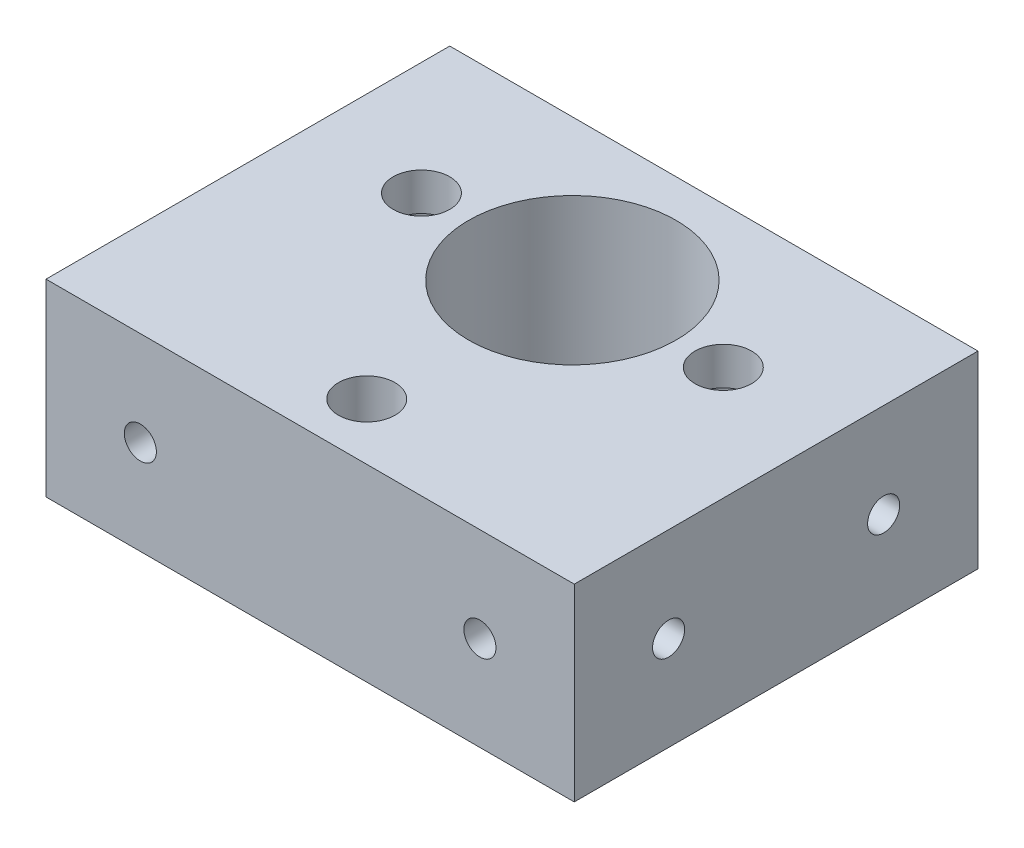
ISO-10303-21;
HEADER;
FILE_DESCRIPTION(('STEP AP214'),'2;1');
FILE_NAME('part.step','',(''),(''),'','','');
FILE_SCHEMA(('AUTOMOTIVE_DESIGN { 1 0 10303 214 1 1 1 1 }'));
ENDSEC;
DATA;
#1=APPLICATION_CONTEXT('core data for automotive mechanical design processes');
#2=APPLICATION_PROTOCOL_DEFINITION('international standard','automotive_design',2000,#1);
#3=PRODUCT_CONTEXT('',#1,'mechanical');
#4=PRODUCT('Part','Part','',(#3));
#5=PRODUCT_RELATED_PRODUCT_CATEGORY('part','',(#4));
#6=PRODUCT_DEFINITION_FORMATION('','',#4);
#7=PRODUCT_DEFINITION_CONTEXT('part definition',#1,'design');
#8=PRODUCT_DEFINITION('design','',#6,#7);
#9=PRODUCT_DEFINITION_SHAPE('','',#8);
#10=(LENGTH_UNIT() NAMED_UNIT(*) SI_UNIT(.MILLI.,.METRE.));
#11=(NAMED_UNIT(*) PLANE_ANGLE_UNIT() SI_UNIT($,.RADIAN.));
#12=(NAMED_UNIT(*) SI_UNIT($,.STERADIAN.) SOLID_ANGLE_UNIT());
#13=UNCERTAINTY_MEASURE_WITH_UNIT(LENGTH_MEASURE(1.E-05),#10,'distance_accuracy_value','');
#14=(GEOMETRIC_REPRESENTATION_CONTEXT(3) GLOBAL_UNCERTAINTY_ASSIGNED_CONTEXT((#13)) GLOBAL_UNIT_ASSIGNED_CONTEXT((#10,
#11,#12)) REPRESENTATION_CONTEXT('',''));
#15=CARTESIAN_POINT('',(0.,0.,0.));
#16=DIRECTION('',(0.,0.,1.));
#17=DIRECTION('',(1.,0.,0.));
#18=AXIS2_PLACEMENT_3D('',#15,#16,#17);
#19=CARTESIAN_POINT('',(-14.,10.,0.));
#20=DIRECTION('',(-1.,0.,0.));
#21=DIRECTION('',(0.,0.,1.));
#22=AXIS2_PLACEMENT_3D('',#19,#20,#21);
#23=PLANE('',#22);
#24=CARTESIAN_POINT('',(-14.,5.,8.9));
#25=DIRECTION('',(-1.,0.,0.));
#26=DIRECTION('',(0.,0.,1.));
#27=AXIS2_PLACEMENT_3D('',#24,#25,#26);
#28=CIRCLE('',#27,0.85);
#29=CARTESIAN_POINT('',(-14.,5.,9.74999999999999));
#30=VERTEX_POINT('',#29);
#31=EDGE_CURVE('E505',#30,#30,#28,.T.);
#32=ORIENTED_EDGE('',*,*,#31,.F.);
#33=EDGE_LOOP('',(#32));
#34=FACE_BOUND('',#33,.T.);
#35=CARTESIAN_POINT('',(-14.,5.,-2.5));
#36=DIRECTION('',(-1.,0.,0.));
#37=DIRECTION('',(0.,0.,1.));
#38=AXIS2_PLACEMENT_3D('',#35,#36,#37);
#39=CIRCLE('',#38,0.849999999999999);
#40=CARTESIAN_POINT('',(-14.,5.,-1.65));
#41=VERTEX_POINT('',#40);
#42=EDGE_CURVE('E495',#41,#41,#39,.T.);
#43=ORIENTED_EDGE('',*,*,#42,.F.);
#44=EDGE_LOOP('',(#43));
#45=FACE_BOUND('',#44,.T.);
#46=DIRECTION('',(0.,0.,-1.));
#47=VECTOR('',#46,1.);
#48=CARTESIAN_POINT('',(-14.,0.,0.));
#49=LINE('',#48,#47);
#50=CARTESIAN_POINT('',(-14.,0.,13.9));
#51=VERTEX_POINT('',#50);
#52=CARTESIAN_POINT('',(-14.,0.,-7.5));
#53=VERTEX_POINT('',#52);
#54=EDGE_CURVE('E122',#51,#53,#49,.T.);
#55=ORIENTED_EDGE('',*,*,#54,.F.);
#56=DIRECTION('',(0.,-1.,0.));
#57=VECTOR('',#56,1.);
#58=CARTESIAN_POINT('',(-14.,10.,13.9));
#59=LINE('',#58,#57);
#60=CARTESIAN_POINT('',(-14.,10.,13.9));
#61=VERTEX_POINT('',#60);
#62=EDGE_CURVE('E12',#61,#51,#59,.T.);
#63=ORIENTED_EDGE('',*,*,#62,.F.);
#64=DIRECTION('',(0.,0.,-1.));
#65=VECTOR('',#64,1.);
#66=CARTESIAN_POINT('',(-14.,10.,0.));
#67=LINE('',#66,#65);
#68=CARTESIAN_POINT('',(-14.,10.,-7.5));
#69=VERTEX_POINT('',#68);
#70=EDGE_CURVE('E103',#61,#69,#67,.T.);
#71=ORIENTED_EDGE('',*,*,#70,.T.);
#72=DIRECTION('',(0.,-1.,0.));
#73=VECTOR('',#72,1.);
#74=CARTESIAN_POINT('',(-14.,10.,-7.5));
#75=LINE('',#74,#73);
#76=EDGE_CURVE('E59',#69,#53,#75,.T.);
#77=ORIENTED_EDGE('',*,*,#76,.T.);
#78=EDGE_LOOP('',(#55,#63,#71,#77));
#79=FACE_BOUND('',#78,.T.);
#80=ADVANCED_FACE('F40',(#34,#45,#79),#23,.T.);
#81=CARTESIAN_POINT('',(0.,10.,13.9));
#82=DIRECTION('',(0.,0.,1.));
#83=DIRECTION('',(1.,0.,0.));
#84=AXIS2_PLACEMENT_3D('',#81,#82,#83);
#85=PLANE('',#84);
#86=CARTESIAN_POINT('',(-9.,5.,13.9));
#87=DIRECTION('',(0.,0.,1.));
#88=DIRECTION('',(1.,0.,0.));
#89=AXIS2_PLACEMENT_3D('',#86,#87,#88);
#90=CIRCLE('',#89,0.85);
#91=CARTESIAN_POINT('',(-8.15,5.,13.9));
#92=VERTEX_POINT('',#91);
#93=EDGE_CURVE('E496',#92,#92,#90,.T.);
#94=ORIENTED_EDGE('',*,*,#93,.F.);
#95=EDGE_LOOP('',(#94));
#96=FACE_BOUND('',#95,.T.);
#97=CARTESIAN_POINT('',(9.,5.,13.9));
#98=DIRECTION('',(0.,0.,1.));
#99=DIRECTION('',(1.,0.,0.));
#100=AXIS2_PLACEMENT_3D('',#97,#98,#99);
#101=CIRCLE('',#100,0.85);
#102=CARTESIAN_POINT('',(9.85,5.,13.9));
#103=VERTEX_POINT('',#102);
#104=EDGE_CURVE('E477',#103,#103,#101,.T.);
#105=ORIENTED_EDGE('',*,*,#104,.F.);
#106=EDGE_LOOP('',(#105));
#107=FACE_BOUND('',#106,.T.);
#108=DIRECTION('',(-1.,0.,0.));
#109=VECTOR('',#108,1.);
#110=CARTESIAN_POINT('',(0.,0.,13.9));
#111=LINE('',#110,#109);
#112=CARTESIAN_POINT('',(14.,0.,13.9));
#113=VERTEX_POINT('',#112);
#114=EDGE_CURVE('E91',#113,#51,#111,.T.);
#115=ORIENTED_EDGE('',*,*,#114,.F.);
#116=DIRECTION('',(0.,-1.,0.));
#117=VECTOR('',#116,1.);
#118=CARTESIAN_POINT('',(14.,10.,13.9));
#119=LINE('',#118,#117);
#120=CARTESIAN_POINT('',(14.,10.,13.9));
#121=VERTEX_POINT('',#120);
#122=EDGE_CURVE('E50',#121,#113,#119,.T.);
#123=ORIENTED_EDGE('',*,*,#122,.F.);
#124=DIRECTION('',(-1.,0.,0.));
#125=VECTOR('',#124,1.);
#126=CARTESIAN_POINT('',(0.,10.,13.9));
#127=LINE('',#126,#125);
#128=EDGE_CURVE('E89',#121,#61,#127,.T.);
#129=ORIENTED_EDGE('',*,*,#128,.T.);
#130=ORIENTED_EDGE('',*,*,#62,.T.);
#131=EDGE_LOOP('',(#115,#123,#129,#130));
#132=FACE_BOUND('',#131,.T.);
#133=ADVANCED_FACE('F87',(#96,#107,#132),#85,.T.);
#134=CARTESIAN_POINT('',(14.,10.,0.));
#135=DIRECTION('',(-1.,0.,0.));
#136=DIRECTION('',(0.,0.,1.));
#137=AXIS2_PLACEMENT_3D('',#134,#135,#136);
#138=PLANE('',#137);
#139=CARTESIAN_POINT('',(14.,5.,8.9));
#140=DIRECTION('',(-1.,0.,0.));
#141=DIRECTION('',(0.,0.,1.));
#142=AXIS2_PLACEMENT_3D('',#139,#140,#141);
#143=CIRCLE('',#142,0.85);
#144=CARTESIAN_POINT('',(14.,5.,9.74999999999999));
#145=VERTEX_POINT('',#144);
#146=EDGE_CURVE('E515',#145,#145,#143,.T.);
#147=ORIENTED_EDGE('',*,*,#146,.T.);
#148=EDGE_LOOP('',(#147));
#149=FACE_BOUND('',#148,.T.);
#150=CARTESIAN_POINT('',(14.,5.,-2.5));
#151=DIRECTION('',(-1.,0.,0.));
#152=DIRECTION('',(0.,0.,1.));
#153=AXIS2_PLACEMENT_3D('',#150,#151,#152);
#154=CIRCLE('',#153,0.849999999999999);
#155=CARTESIAN_POINT('',(14.,5.,-1.65));
#156=VERTEX_POINT('',#155);
#157=EDGE_CURVE('E504',#156,#156,#154,.T.);
#158=ORIENTED_EDGE('',*,*,#157,.T.);
#159=EDGE_LOOP('',(#158));
#160=FACE_BOUND('',#159,.T.);
#161=DIRECTION('',(0.,0.,-1.));
#162=VECTOR('',#161,1.);
#163=CARTESIAN_POINT('',(14.,0.,0.));
#164=LINE('',#163,#162);
#165=CARTESIAN_POINT('',(14.,0.,-7.5));
#166=VERTEX_POINT('',#165);
#167=EDGE_CURVE('E125',#113,#166,#164,.T.);
#168=ORIENTED_EDGE('',*,*,#167,.T.);
#169=DIRECTION('',(0.,-1.,0.));
#170=VECTOR('',#169,1.);
#171=CARTESIAN_POINT('',(14.,10.,-7.5));
#172=LINE('',#171,#170);
#173=CARTESIAN_POINT('',(14.,10.,-7.5));
#174=VERTEX_POINT('',#173);
#175=EDGE_CURVE('E73',#174,#166,#172,.T.);
#176=ORIENTED_EDGE('',*,*,#175,.F.);
#177=DIRECTION('',(0.,0.,-1.));
#178=VECTOR('',#177,1.);
#179=CARTESIAN_POINT('',(14.,10.,0.));
#180=LINE('',#179,#178);
#181=EDGE_CURVE('E95',#121,#174,#180,.T.);
#182=ORIENTED_EDGE('',*,*,#181,.F.);
#183=ORIENTED_EDGE('',*,*,#122,.T.);
#184=EDGE_LOOP('',(#168,#176,#182,#183));
#185=FACE_BOUND('',#184,.T.);
#186=ADVANCED_FACE('F96',(#149,#160,#185),#138,.F.);
#187=CARTESIAN_POINT('',(8.,10.,0.));
#188=DIRECTION('',(0.,-1.,0.));
#189=DIRECTION('',(0.,0.,-1.));
#190=AXIS2_PLACEMENT_3D('',#187,#188,#189);
#191=CYLINDRICAL_SURFACE('',#190,1.5);
#192=CARTESIAN_POINT('',(8.,8.,0.));
#193=DIRECTION('',(0.,1.,0.));
#194=DIRECTION('',(0.,0.,1.));
#195=AXIS2_PLACEMENT_3D('',#192,#193,#194);
#196=CIRCLE('',#195,1.5);
#197=CARTESIAN_POINT('',(8.,8.,1.5));
#198=VERTEX_POINT('',#197);
#199=EDGE_CURVE('E44',#198,#198,#196,.T.);
#200=ORIENTED_EDGE('',*,*,#199,.F.);
#201=EDGE_LOOP('',(#200));
#202=FACE_BOUND('',#201,.T.);
#203=CARTESIAN_POINT('',(8.,10.,0.));
#204=DIRECTION('',(0.,1.,0.));
#205=DIRECTION('',(0.,0.,1.));
#206=AXIS2_PLACEMENT_3D('',#203,#204,#205);
#207=CIRCLE('',#206,1.5);
#208=CARTESIAN_POINT('',(8.,10.,1.5));
#209=VERTEX_POINT('',#208);
#210=EDGE_CURVE('E113',#209,#209,#207,.T.);
#211=ORIENTED_EDGE('',*,*,#210,.T.);
#212=EDGE_LOOP('',(#211));
#213=FACE_BOUND('',#212,.T.);
#214=ADVANCED_FACE('F186',(#202,#213),#191,.F.);
#215=CARTESIAN_POINT('',(-8.,10.,0.));
#216=DIRECTION('',(0.,-1.,0.));
#217=DIRECTION('',(0.,0.,-1.));
#218=AXIS2_PLACEMENT_3D('',#215,#216,#217);
#219=CYLINDRICAL_SURFACE('',#218,1.5);
#220=CARTESIAN_POINT('',(-8.,8.,0.));
#221=DIRECTION('',(0.,1.,0.));
#222=DIRECTION('',(0.,0.,1.));
#223=AXIS2_PLACEMENT_3D('',#220,#221,#222);
#224=CIRCLE('',#223,1.5);
#225=CARTESIAN_POINT('',(-8.,8.,1.5));
#226=VERTEX_POINT('',#225);
#227=EDGE_CURVE('E134',#226,#226,#224,.T.);
#228=ORIENTED_EDGE('',*,*,#227,.F.);
#229=EDGE_LOOP('',(#228));
#230=FACE_BOUND('',#229,.T.);
#231=CARTESIAN_POINT('',(-8.,10.,0.));
#232=DIRECTION('',(0.,1.,0.));
#233=DIRECTION('',(0.,0.,1.));
#234=AXIS2_PLACEMENT_3D('',#231,#232,#233);
#235=CIRCLE('',#234,1.5);
#236=CARTESIAN_POINT('',(-8.,10.,1.5));
#237=VERTEX_POINT('',#236);
#238=EDGE_CURVE('E110',#237,#237,#235,.T.);
#239=ORIENTED_EDGE('',*,*,#238,.T.);
#240=EDGE_LOOP('',(#239));
#241=FACE_BOUND('',#240,.T.);
#242=ADVANCED_FACE('F191',(#230,#241),#219,.F.);
#243=CARTESIAN_POINT('',(0.,10.,-7.5));
#244=DIRECTION('',(0.,0.,-1.));
#245=DIRECTION('',(-1.,0.,0.));
#246=AXIS2_PLACEMENT_3D('',#243,#244,#245);
#247=PLANE('',#246);
#248=CARTESIAN_POINT('',(-9.,5.,-7.5));
#249=DIRECTION('',(0.,0.,-1.));
#250=DIRECTION('',(-1.,0.,0.));
#251=AXIS2_PLACEMENT_3D('',#248,#249,#250);
#252=CIRCLE('',#251,0.85);
#253=CARTESIAN_POINT('',(-9.85,5.,-7.5));
#254=VERTEX_POINT('',#253);
#255=EDGE_CURVE('E478',#254,#254,#252,.T.);
#256=ORIENTED_EDGE('',*,*,#255,.F.);
#257=EDGE_LOOP('',(#256));
#258=FACE_BOUND('',#257,.T.);
#259=CARTESIAN_POINT('',(9.,5.,-7.5));
#260=DIRECTION('',(0.,0.,-1.));
#261=DIRECTION('',(-1.,0.,0.));
#262=AXIS2_PLACEMENT_3D('',#259,#260,#261);
#263=CIRCLE('',#262,0.85);
#264=CARTESIAN_POINT('',(8.15,5.,-7.5));
#265=VERTEX_POINT('',#264);
#266=EDGE_CURVE('E489',#265,#265,#263,.T.);
#267=ORIENTED_EDGE('',*,*,#266,.F.);
#268=EDGE_LOOP('',(#267));
#269=FACE_BOUND('',#268,.T.);
#270=DIRECTION('',(1.,0.,0.));
#271=VECTOR('',#270,1.);
#272=CARTESIAN_POINT('',(0.,0.,-7.5));
#273=LINE('',#272,#271);
#274=EDGE_CURVE('E127',#53,#166,#273,.T.);
#275=ORIENTED_EDGE('',*,*,#274,.F.);
#276=ORIENTED_EDGE('',*,*,#76,.F.);
#277=DIRECTION('',(1.,0.,0.));
#278=VECTOR('',#277,1.);
#279=CARTESIAN_POINT('',(0.,10.,-7.5));
#280=LINE('',#279,#278);
#281=EDGE_CURVE('E99',#69,#174,#280,.T.);
#282=ORIENTED_EDGE('',*,*,#281,.T.);
#283=ORIENTED_EDGE('',*,*,#175,.T.);
#284=EDGE_LOOP('',(#275,#276,#282,#283));
#285=FACE_BOUND('',#284,.T.);
#286=ADVANCED_FACE('F188',(#258,#269,#285),#247,.T.);
#287=CARTESIAN_POINT('',(0.,10.,0.));
#288=DIRECTION('',(0.,-1.,0.));
#289=DIRECTION('',(0.,0.,-1.));
#290=AXIS2_PLACEMENT_3D('',#287,#288,#289);
#291=CYLINDRICAL_SURFACE('',#290,5.5);
#292=CARTESIAN_POINT('',(0.,10.,0.));
#293=DIRECTION('',(0.,1.,0.));
#294=DIRECTION('',(0.,0.,1.));
#295=AXIS2_PLACEMENT_3D('',#292,#293,#294);
#296=CIRCLE('',#295,5.5);
#297=CARTESIAN_POINT('',(0.,10.,5.5));
#298=VERTEX_POINT('',#297);
#299=EDGE_CURVE('E105',#298,#298,#296,.T.);
#300=ORIENTED_EDGE('',*,*,#299,.T.);
#301=EDGE_LOOP('',(#300));
#302=FACE_BOUND('',#301,.T.);
#303=CARTESIAN_POINT('',(0.,0.,0.));
#304=DIRECTION('',(0.,1.,0.));
#305=DIRECTION('',(0.,0.,1.));
#306=AXIS2_PLACEMENT_3D('',#303,#304,#305);
#307=CIRCLE('',#306,5.5);
#308=CARTESIAN_POINT('',(0.,0.,5.5));
#309=VERTEX_POINT('',#308);
#310=EDGE_CURVE('E119',#309,#309,#307,.T.);
#311=ORIENTED_EDGE('',*,*,#310,.F.);
#312=EDGE_LOOP('',(#311));
#313=FACE_BOUND('',#312,.T.);
#314=ADVANCED_FACE('F42',(#302,#313),#291,.F.);
#315=CARTESIAN_POINT('',(0.,10.,10.9));
#316=DIRECTION('',(0.,-1.,0.));
#317=DIRECTION('',(0.,0.,-1.));
#318=AXIS2_PLACEMENT_3D('',#315,#316,#317);
#319=CYLINDRICAL_SURFACE('',#318,1.5);
#320=CARTESIAN_POINT('',(0.,10.,10.9));
#321=DIRECTION('',(0.,1.,0.));
#322=DIRECTION('',(0.,0.,1.));
#323=AXIS2_PLACEMENT_3D('',#320,#321,#322);
#324=CIRCLE('',#323,1.5);
#325=CARTESIAN_POINT('',(0.,10.,12.4));
#326=VERTEX_POINT('',#325);
#327=EDGE_CURVE('E116',#326,#326,#324,.T.);
#328=ORIENTED_EDGE('',*,*,#327,.T.);
#329=EDGE_LOOP('',(#328));
#330=FACE_BOUND('',#329,.T.);
#331=CARTESIAN_POINT('',(0.,0.,10.9));
#332=DIRECTION('',(0.,1.,0.));
#333=DIRECTION('',(0.,0.,1.));
#334=AXIS2_PLACEMENT_3D('',#331,#332,#333);
#335=CIRCLE('',#334,1.5);
#336=CARTESIAN_POINT('',(0.,0.,12.4));
#337=VERTEX_POINT('',#336);
#338=EDGE_CURVE('E130',#337,#337,#335,.T.);
#339=ORIENTED_EDGE('',*,*,#338,.F.);
#340=EDGE_LOOP('',(#339));
#341=FACE_BOUND('',#340,.T.);
#342=ADVANCED_FACE('F162',(#330,#341),#319,.F.);
#343=CARTESIAN_POINT('',(0.,10.,0.));
#344=DIRECTION('',(0.,1.,0.));
#345=DIRECTION('',(0.,0.,1.));
#346=AXIS2_PLACEMENT_3D('',#343,#344,#345);
#347=PLANE('',#346);
#348=ORIENTED_EDGE('',*,*,#299,.F.);
#349=EDGE_LOOP('',(#348));
#350=FACE_BOUND('',#349,.T.);
#351=ORIENTED_EDGE('',*,*,#70,.F.);
#352=ORIENTED_EDGE('',*,*,#128,.F.);
#353=ORIENTED_EDGE('',*,*,#181,.T.);
#354=ORIENTED_EDGE('',*,*,#281,.F.);
#355=EDGE_LOOP('',(#351,#352,#353,#354));
#356=FACE_BOUND('',#355,.T.);
#357=ORIENTED_EDGE('',*,*,#238,.F.);
#358=EDGE_LOOP('',(#357));
#359=FACE_BOUND('',#358,.T.);
#360=ORIENTED_EDGE('',*,*,#210,.F.);
#361=EDGE_LOOP('',(#360));
#362=FACE_BOUND('',#361,.T.);
#363=ORIENTED_EDGE('',*,*,#327,.F.);
#364=EDGE_LOOP('',(#363));
#365=FACE_BOUND('',#364,.T.);
#366=ADVANCED_FACE('F101',(#350,#356,#359,#362,#365),#347,.T.);
#367=CARTESIAN_POINT('',(0.,0.,0.));
#368=DIRECTION('',(0.,1.,0.));
#369=DIRECTION('',(0.,0.,1.));
#370=AXIS2_PLACEMENT_3D('',#367,#368,#369);
#371=PLANE('',#370);
#372=CARTESIAN_POINT('',(8.,0.,0.));
#373=DIRECTION('',(0.,1.,0.));
#374=DIRECTION('',(0.,0.,1.));
#375=AXIS2_PLACEMENT_3D('',#372,#373,#374);
#376=CIRCLE('',#375,2.25);
#377=CARTESIAN_POINT('',(8.,0.,2.25));
#378=VERTEX_POINT('',#377);
#379=EDGE_CURVE('E141',#378,#378,#376,.T.);
#380=ORIENTED_EDGE('',*,*,#379,.T.);
#381=EDGE_LOOP('',(#380));
#382=FACE_BOUND('',#381,.T.);
#383=CARTESIAN_POINT('',(-8.,0.,0.));
#384=DIRECTION('',(0.,1.,0.));
#385=DIRECTION('',(0.,0.,1.));
#386=AXIS2_PLACEMENT_3D('',#383,#384,#385);
#387=CIRCLE('',#386,2.25);
#388=CARTESIAN_POINT('',(-8.,0.,2.25));
#389=VERTEX_POINT('',#388);
#390=EDGE_CURVE('E146',#389,#389,#387,.T.);
#391=ORIENTED_EDGE('',*,*,#390,.T.);
#392=EDGE_LOOP('',(#391));
#393=FACE_BOUND('',#392,.T.);
#394=ORIENTED_EDGE('',*,*,#310,.T.);
#395=EDGE_LOOP('',(#394));
#396=FACE_BOUND('',#395,.T.);
#397=ORIENTED_EDGE('',*,*,#54,.T.);
#398=ORIENTED_EDGE('',*,*,#274,.T.);
#399=ORIENTED_EDGE('',*,*,#167,.F.);
#400=ORIENTED_EDGE('',*,*,#114,.T.);
#401=EDGE_LOOP('',(#397,#398,#399,#400));
#402=FACE_BOUND('',#401,.T.);
#403=ORIENTED_EDGE('',*,*,#338,.T.);
#404=EDGE_LOOP('',(#403));
#405=FACE_BOUND('',#404,.T.);
#406=ADVANCED_FACE('F161',(#382,#393,#396,#402,#405),#371,.F.);
#407=CARTESIAN_POINT('',(-8.,16.3639610306789,0.));
#408=DIRECTION('',(0.,-1.,0.));
#409=DIRECTION('',(0.,0.,-1.));
#410=AXIS2_PLACEMENT_3D('',#407,#408,#409);
#411=CYLINDRICAL_SURFACE('',#410,2.25);
#412=ORIENTED_EDGE('',*,*,#390,.F.);
#413=EDGE_LOOP('',(#412));
#414=FACE_BOUND('',#413,.T.);
#415=CARTESIAN_POINT('',(-8.,8.,0.));
#416=DIRECTION('',(0.,1.,0.));
#417=DIRECTION('',(0.,0.,1.));
#418=AXIS2_PLACEMENT_3D('',#415,#416,#417);
#419=CIRCLE('',#418,2.25);
#420=CARTESIAN_POINT('',(-8.,8.,2.25));
#421=VERTEX_POINT('',#420);
#422=EDGE_CURVE('E150',#421,#421,#419,.T.);
#423=ORIENTED_EDGE('',*,*,#422,.T.);
#424=EDGE_LOOP('',(#423));
#425=FACE_BOUND('',#424,.T.);
#426=ADVANCED_FACE('F168',(#414,#425),#411,.F.);
#427=CARTESIAN_POINT('',(0.,8.,0.));
#428=DIRECTION('',(0.,1.,0.));
#429=DIRECTION('',(0.,0.,1.));
#430=AXIS2_PLACEMENT_3D('',#427,#428,#429);
#431=PLANE('',#430);
#432=ORIENTED_EDGE('',*,*,#227,.T.);
#433=EDGE_LOOP('',(#432));
#434=FACE_BOUND('',#433,.T.);
#435=ORIENTED_EDGE('',*,*,#422,.F.);
#436=EDGE_LOOP('',(#435));
#437=FACE_BOUND('',#436,.T.);
#438=ADVANCED_FACE('F223',(#434,#437),#431,.F.);
#439=CARTESIAN_POINT('',(8.,16.3639610306789,0.));
#440=DIRECTION('',(0.,-1.,0.));
#441=DIRECTION('',(0.,0.,-1.));
#442=AXIS2_PLACEMENT_3D('',#439,#440,#441);
#443=CYLINDRICAL_SURFACE('',#442,2.25);
#444=ORIENTED_EDGE('',*,*,#379,.F.);
#445=EDGE_LOOP('',(#444));
#446=FACE_BOUND('',#445,.T.);
#447=CARTESIAN_POINT('',(8.,8.,0.));
#448=DIRECTION('',(0.,1.,0.));
#449=DIRECTION('',(0.,0.,1.));
#450=AXIS2_PLACEMENT_3D('',#447,#448,#449);
#451=CIRCLE('',#450,2.25);
#452=CARTESIAN_POINT('',(8.,8.,2.25));
#453=VERTEX_POINT('',#452);
#454=EDGE_CURVE('E136',#453,#453,#451,.T.);
#455=ORIENTED_EDGE('',*,*,#454,.T.);
#456=EDGE_LOOP('',(#455));
#457=FACE_BOUND('',#456,.T.);
#458=ADVANCED_FACE('F214',(#446,#457),#443,.F.);
#459=CARTESIAN_POINT('',(0.,8.,0.));
#460=DIRECTION('',(0.,1.,0.));
#461=DIRECTION('',(0.,0.,1.));
#462=AXIS2_PLACEMENT_3D('',#459,#460,#461);
#463=PLANE('',#462);
#464=ORIENTED_EDGE('',*,*,#199,.T.);
#465=EDGE_LOOP('',(#464));
#466=FACE_BOUND('',#465,.T.);
#467=ORIENTED_EDGE('',*,*,#454,.F.);
#468=EDGE_LOOP('',(#467));
#469=FACE_BOUND('',#468,.T.);
#470=ADVANCED_FACE('F210',(#466,#469),#463,.F.);
#471=CARTESIAN_POINT('',(10.,5.,-2.5));
#472=DIRECTION('',(1.,0.,0.));
#473=DIRECTION('',(0.,0.,-1.));
#474=AXIS2_PLACEMENT_3D('',#471,#472,#473);
#475=CYLINDRICAL_SURFACE('',#474,0.849999999999999);
#476=CARTESIAN_POINT('',(10.,5.,-2.5));
#477=DIRECTION('',(-1.,0.,0.));
#478=DIRECTION('',(0.,0.,1.));
#479=AXIS2_PLACEMENT_3D('',#476,#477,#478);
#480=CIRCLE('',#479,0.849999999999999);
#481=CARTESIAN_POINT('',(10.,5.,-1.65));
#482=VERTEX_POINT('',#481);
#483=EDGE_CURVE('E518',#482,#482,#480,.T.);
#484=ORIENTED_EDGE('',*,*,#483,.T.);
#485=EDGE_LOOP('',(#484));
#486=FACE_BOUND('',#485,.T.);
#487=ORIENTED_EDGE('',*,*,#157,.F.);
#488=EDGE_LOOP('',(#487));
#489=FACE_BOUND('',#488,.T.);
#490=ADVANCED_FACE('F213',(#486,#489),#475,.F.);
#491=CARTESIAN_POINT('',(10.,5.,-2.5));
#492=DIRECTION('',(-1.,0.,0.));
#493=DIRECTION('',(0.,0.,1.));
#494=AXIS2_PLACEMENT_3D('',#491,#492,#493);
#495=PLANE('',#494);
#496=ORIENTED_EDGE('',*,*,#483,.F.);
#497=EDGE_LOOP('',(#496));
#498=FACE_BOUND('',#497,.T.);
#499=ADVANCED_FACE('F220',(#498),#495,.F.);
#500=CARTESIAN_POINT('',(10.,5.,8.9));
#501=DIRECTION('',(1.,0.,0.));
#502=DIRECTION('',(0.,0.,-1.));
#503=AXIS2_PLACEMENT_3D('',#500,#501,#502);
#504=CYLINDRICAL_SURFACE('',#503,0.85);
#505=CARTESIAN_POINT('',(10.,5.,8.9));
#506=DIRECTION('',(-1.,0.,0.));
#507=DIRECTION('',(0.,0.,1.));
#508=AXIS2_PLACEMENT_3D('',#505,#506,#507);
#509=CIRCLE('',#508,0.85);
#510=CARTESIAN_POINT('',(10.,5.,9.74999999999999));
#511=VERTEX_POINT('',#510);
#512=EDGE_CURVE('E153',#511,#511,#509,.T.);
#513=ORIENTED_EDGE('',*,*,#512,.T.);
#514=EDGE_LOOP('',(#513));
#515=FACE_BOUND('',#514,.T.);
#516=ORIENTED_EDGE('',*,*,#146,.F.);
#517=EDGE_LOOP('',(#516));
#518=FACE_BOUND('',#517,.T.);
#519=ADVANCED_FACE('F316',(#515,#518),#504,.F.);
#520=CARTESIAN_POINT('',(10.,5.,8.9));
#521=DIRECTION('',(-1.,0.,0.));
#522=DIRECTION('',(0.,0.,1.));
#523=AXIS2_PLACEMENT_3D('',#520,#521,#522);
#524=PLANE('',#523);
#525=ORIENTED_EDGE('',*,*,#512,.F.);
#526=EDGE_LOOP('',(#525));
#527=FACE_BOUND('',#526,.T.);
#528=ADVANCED_FACE('F326',(#527),#524,.F.);
#529=CARTESIAN_POINT('',(-10.,5.,-2.5));
#530=DIRECTION('',(-1.,0.,0.));
#531=DIRECTION('',(0.,0.,1.));
#532=AXIS2_PLACEMENT_3D('',#529,#530,#531);
#533=CYLINDRICAL_SURFACE('',#532,0.849999999999999);
#534=CARTESIAN_POINT('',(-10.,5.,-2.5));
#535=DIRECTION('',(-1.,0.,0.));
#536=DIRECTION('',(0.,0.,1.));
#537=AXIS2_PLACEMENT_3D('',#534,#535,#536);
#538=CIRCLE('',#537,0.849999999999999);
#539=CARTESIAN_POINT('',(-10.,5.,-1.65));
#540=VERTEX_POINT('',#539);
#541=EDGE_CURVE('E508',#540,#540,#538,.T.);
#542=ORIENTED_EDGE('',*,*,#541,.F.);
#543=EDGE_LOOP('',(#542));
#544=FACE_BOUND('',#543,.T.);
#545=ORIENTED_EDGE('',*,*,#42,.T.);
#546=EDGE_LOOP('',(#545));
#547=FACE_BOUND('',#546,.T.);
#548=ADVANCED_FACE('F335',(#544,#547),#533,.F.);
#549=CARTESIAN_POINT('',(-10.,5.,-2.5));
#550=DIRECTION('',(-1.,0.,0.));
#551=DIRECTION('',(0.,0.,1.));
#552=AXIS2_PLACEMENT_3D('',#549,#550,#551);
#553=PLANE('',#552);
#554=ORIENTED_EDGE('',*,*,#541,.T.);
#555=EDGE_LOOP('',(#554));
#556=FACE_BOUND('',#555,.T.);
#557=ADVANCED_FACE('F352',(#556),#553,.T.);
#558=CARTESIAN_POINT('',(-10.,5.,8.9));
#559=DIRECTION('',(-1.,0.,0.));
#560=DIRECTION('',(0.,0.,1.));
#561=AXIS2_PLACEMENT_3D('',#558,#559,#560);
#562=CYLINDRICAL_SURFACE('',#561,0.85);
#563=CARTESIAN_POINT('',(-10.,5.,8.9));
#564=DIRECTION('',(-1.,0.,0.));
#565=DIRECTION('',(0.,0.,1.));
#566=AXIS2_PLACEMENT_3D('',#563,#564,#565);
#567=CIRCLE('',#566,0.85);
#568=CARTESIAN_POINT('',(-10.,5.,9.74999999999999));
#569=VERTEX_POINT('',#568);
#570=EDGE_CURVE('E501',#569,#569,#567,.T.);
#571=ORIENTED_EDGE('',*,*,#570,.F.);
#572=EDGE_LOOP('',(#571));
#573=FACE_BOUND('',#572,.T.);
#574=ORIENTED_EDGE('',*,*,#31,.T.);
#575=EDGE_LOOP('',(#574));
#576=FACE_BOUND('',#575,.T.);
#577=ADVANCED_FACE('F362',(#573,#576),#562,.F.);
#578=CARTESIAN_POINT('',(-10.,5.,8.9));
#579=DIRECTION('',(-1.,0.,0.));
#580=DIRECTION('',(0.,0.,1.));
#581=AXIS2_PLACEMENT_3D('',#578,#579,#580);
#582=PLANE('',#581);
#583=ORIENTED_EDGE('',*,*,#570,.T.);
#584=EDGE_LOOP('',(#583));
#585=FACE_BOUND('',#584,.T.);
#586=ADVANCED_FACE('F372',(#585),#582,.T.);
#587=CARTESIAN_POINT('',(9.,5.,9.9));
#588=DIRECTION('',(0.,0.,1.));
#589=DIRECTION('',(1.,0.,0.));
#590=AXIS2_PLACEMENT_3D('',#587,#588,#589);
#591=CYLINDRICAL_SURFACE('',#590,0.85);
#592=CARTESIAN_POINT('',(9.,5.,9.9));
#593=DIRECTION('',(0.,0.,1.));
#594=DIRECTION('',(1.,0.,0.));
#595=AXIS2_PLACEMENT_3D('',#592,#593,#594);
#596=CIRCLE('',#595,0.85);
#597=CARTESIAN_POINT('',(9.85,5.,9.9));
#598=VERTEX_POINT('',#597);
#599=EDGE_CURVE('E481',#598,#598,#596,.T.);
#600=ORIENTED_EDGE('',*,*,#599,.F.);
#601=EDGE_LOOP('',(#600));
#602=FACE_BOUND('',#601,.T.);
#603=ORIENTED_EDGE('',*,*,#104,.T.);
#604=EDGE_LOOP('',(#603));
#605=FACE_BOUND('',#604,.T.);
#606=ADVANCED_FACE('F382',(#602,#605),#591,.F.);
#607=CARTESIAN_POINT('',(9.,5.,9.9));
#608=DIRECTION('',(0.,0.,1.));
#609=DIRECTION('',(1.,0.,0.));
#610=AXIS2_PLACEMENT_3D('',#607,#608,#609);
#611=PLANE('',#610);
#612=ORIENTED_EDGE('',*,*,#599,.T.);
#613=EDGE_LOOP('',(#612));
#614=FACE_BOUND('',#613,.T.);
#615=ADVANCED_FACE('F397',(#614),#611,.T.);
#616=CARTESIAN_POINT('',(-9.,5.,9.9));
#617=DIRECTION('',(0.,0.,1.));
#618=DIRECTION('',(1.,0.,0.));
#619=AXIS2_PLACEMENT_3D('',#616,#617,#618);
#620=CYLINDRICAL_SURFACE('',#619,0.85);
#621=CARTESIAN_POINT('',(-9.,5.,9.9));
#622=DIRECTION('',(0.,0.,1.));
#623=DIRECTION('',(1.,0.,0.));
#624=AXIS2_PLACEMENT_3D('',#621,#622,#623);
#625=CIRCLE('',#624,0.85);
#626=CARTESIAN_POINT('',(-8.15,5.,9.9));
#627=VERTEX_POINT('',#626);
#628=EDGE_CURVE('E492',#627,#627,#625,.T.);
#629=ORIENTED_EDGE('',*,*,#628,.F.);
#630=EDGE_LOOP('',(#629));
#631=FACE_BOUND('',#630,.T.);
#632=ORIENTED_EDGE('',*,*,#93,.T.);
#633=EDGE_LOOP('',(#632));
#634=FACE_BOUND('',#633,.T.);
#635=ADVANCED_FACE('F407',(#631,#634),#620,.F.);
#636=CARTESIAN_POINT('',(-9.,5.,9.9));
#637=DIRECTION('',(0.,0.,1.));
#638=DIRECTION('',(1.,0.,0.));
#639=AXIS2_PLACEMENT_3D('',#636,#637,#638);
#640=PLANE('',#639);
#641=ORIENTED_EDGE('',*,*,#628,.T.);
#642=EDGE_LOOP('',(#641));
#643=FACE_BOUND('',#642,.T.);
#644=ADVANCED_FACE('F417',(#643),#640,.T.);
#645=CARTESIAN_POINT('',(9.,5.,-3.5));
#646=DIRECTION('',(0.,0.,-1.));
#647=DIRECTION('',(-1.,0.,0.));
#648=AXIS2_PLACEMENT_3D('',#645,#646,#647);
#649=CYLINDRICAL_SURFACE('',#648,0.85);
#650=CARTESIAN_POINT('',(9.,5.,-3.5));
#651=DIRECTION('',(0.,0.,-1.));
#652=DIRECTION('',(-1.,0.,0.));
#653=AXIS2_PLACEMENT_3D('',#650,#651,#652);
#654=CIRCLE('',#653,0.85);
#655=CARTESIAN_POINT('',(8.15,5.,-3.5));
#656=VERTEX_POINT('',#655);
#657=EDGE_CURVE('E484',#656,#656,#654,.T.);
#658=ORIENTED_EDGE('',*,*,#657,.F.);
#659=EDGE_LOOP('',(#658));
#660=FACE_BOUND('',#659,.T.);
#661=ORIENTED_EDGE('',*,*,#266,.T.);
#662=EDGE_LOOP('',(#661));
#663=FACE_BOUND('',#662,.T.);
#664=ADVANCED_FACE('F426',(#660,#663),#649,.F.);
#665=CARTESIAN_POINT('',(9.,5.,-3.5));
#666=DIRECTION('',(0.,0.,-1.));
#667=DIRECTION('',(-1.,0.,0.));
#668=AXIS2_PLACEMENT_3D('',#665,#666,#667);
#669=PLANE('',#668);
#670=ORIENTED_EDGE('',*,*,#657,.T.);
#671=EDGE_LOOP('',(#670));
#672=FACE_BOUND('',#671,.T.);
#673=ADVANCED_FACE('F440',(#672),#669,.T.);
#674=CARTESIAN_POINT('',(-9.,5.,-3.5));
#675=DIRECTION('',(0.,0.,-1.));
#676=DIRECTION('',(-1.,0.,0.));
#677=AXIS2_PLACEMENT_3D('',#674,#675,#676);
#678=CYLINDRICAL_SURFACE('',#677,0.85);
#679=CARTESIAN_POINT('',(-9.,5.,-3.5));
#680=DIRECTION('',(0.,0.,-1.));
#681=DIRECTION('',(-1.,0.,0.));
#682=AXIS2_PLACEMENT_3D('',#679,#680,#681);
#683=CIRCLE('',#682,0.85);
#684=CARTESIAN_POINT('',(-9.85,5.,-3.5));
#685=VERTEX_POINT('',#684);
#686=EDGE_CURVE('E476',#685,#685,#683,.T.);
#687=ORIENTED_EDGE('',*,*,#686,.F.);
#688=EDGE_LOOP('',(#687));
#689=FACE_BOUND('',#688,.T.);
#690=ORIENTED_EDGE('',*,*,#255,.T.);
#691=EDGE_LOOP('',(#690));
#692=FACE_BOUND('',#691,.T.);
#693=ADVANCED_FACE('F450',(#689,#692),#678,.F.);
#694=CARTESIAN_POINT('',(-9.,5.,-3.5));
#695=DIRECTION('',(0.,0.,-1.));
#696=DIRECTION('',(-1.,0.,0.));
#697=AXIS2_PLACEMENT_3D('',#694,#695,#696);
#698=PLANE('',#697);
#699=ORIENTED_EDGE('',*,*,#686,.T.);
#700=EDGE_LOOP('',(#699));
#701=FACE_BOUND('',#700,.T.);
#702=ADVANCED_FACE('F460',(#701),#698,.T.);
#703=CLOSED_SHELL('',(#80,#133,#186,#214,#242,#286,#314,#342,#366,#406,#426,#438,#458,#470,#490,
#499,#519,#528,#548,#557,#577,#586,#606,#615,#635,#644,#664,#673,#693,#702));
#704=MANIFOLD_SOLID_BREP('B2',#703);
#705=ADVANCED_BREP_SHAPE_REPRESENTATION('',(#18,#704),#14);
#706=SHAPE_DEFINITION_REPRESENTATION(#9,#705);
ENDSEC;
END-ISO-10303-21;
